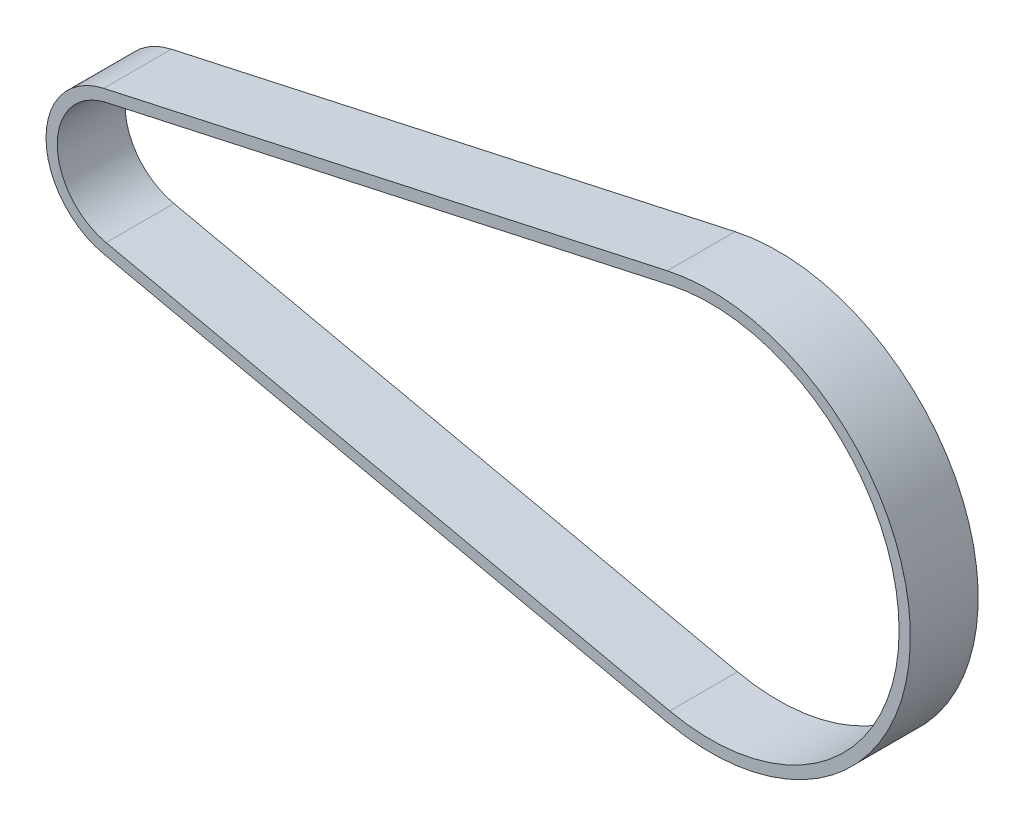
ISO-10303-21;
HEADER;
FILE_DESCRIPTION(('STEP AP214'),'2;1');
FILE_NAME('part.step','',(''),(''),'','','');
FILE_SCHEMA(('AUTOMOTIVE_DESIGN { 1 0 10303 214 1 1 1 1 }'));
ENDSEC;
DATA;
#1=APPLICATION_CONTEXT('core data for automotive mechanical design processes');
#2=APPLICATION_PROTOCOL_DEFINITION('international standard','automotive_design',2000,#1);
#3=PRODUCT_CONTEXT('',#1,'mechanical');
#4=PRODUCT('Part','Part','',(#3));
#5=PRODUCT_RELATED_PRODUCT_CATEGORY('part','',(#4));
#6=PRODUCT_DEFINITION_FORMATION('','',#4);
#7=PRODUCT_DEFINITION_CONTEXT('part definition',#1,'design');
#8=PRODUCT_DEFINITION('design','',#6,#7);
#9=PRODUCT_DEFINITION_SHAPE('','',#8);
#10=(LENGTH_UNIT() NAMED_UNIT(*) SI_UNIT(.MILLI.,.METRE.));
#11=(NAMED_UNIT(*) PLANE_ANGLE_UNIT() SI_UNIT($,.RADIAN.));
#12=(NAMED_UNIT(*) SI_UNIT($,.STERADIAN.) SOLID_ANGLE_UNIT());
#13=UNCERTAINTY_MEASURE_WITH_UNIT(LENGTH_MEASURE(1.E-05),#10,'distance_accuracy_value','');
#14=(GEOMETRIC_REPRESENTATION_CONTEXT(3) GLOBAL_UNCERTAINTY_ASSIGNED_CONTEXT((#13)) GLOBAL_UNIT_ASSIGNED_CONTEXT((#10,
#11,#12)) REPRESENTATION_CONTEXT('',''));
#15=CARTESIAN_POINT('',(0.,0.,0.));
#16=DIRECTION('',(0.,0.,1.));
#17=DIRECTION('',(1.,0.,0.));
#18=AXIS2_PLACEMENT_3D('',#15,#16,#17);
#19=CARTESIAN_POINT('',(0.,0.,6.));
#20=DIRECTION('',(0.,0.,1.));
#21=DIRECTION('',(1.,0.,0.));
#22=AXIS2_PLACEMENT_3D('',#19,#20,#21);
#23=PLANE('',#22);
#24=CARTESIAN_POINT('',(0.,0.,6.));
#25=DIRECTION('',(0.,0.,1.));
#26=DIRECTION('',(1.,0.,0.));
#27=AXIS2_PLACEMENT_3D('',#24,#25,#26);
#28=CIRCLE('',#27,6.5);
#29=CARTESIAN_POINT('',(-1.39445506692161,6.34866088764683,6.));
#30=VERTEX_POINT('',#29);
#31=CARTESIAN_POINT('',(-1.3944550669216,-6.34866088764683,6.));
#32=VERTEX_POINT('',#31);
#33=EDGE_CURVE('E153',#30,#32,#28,.T.);
#34=ORIENTED_EDGE('',*,*,#33,.T.);
#35=DIRECTION('',(0.976717059637974,-0.21453154875717,0.));
#36=VECTOR('',#35,1.);
#37=CARTESIAN_POINT('',(-1.3944550669216,-6.34866088764683,6.));
#38=LINE('',#37,#36);
#39=CARTESIAN_POINT('',(48.4985009560229,-17.3074262967849,6.));
#40=VERTEX_POINT('',#39);
#41=EDGE_CURVE('E157',#32,#40,#38,.T.);
#42=ORIENTED_EDGE('',*,*,#41,.T.);
#43=CARTESIAN_POINT('',(52.3,0.,6.));
#44=DIRECTION('',(0.,0.,1.));
#45=DIRECTION('',(1.,0.,0.));
#46=AXIS2_PLACEMENT_3D('',#43,#44,#45);
#47=CIRCLE('',#46,17.72);
#48=CARTESIAN_POINT('',(48.498500956023,17.3074262967849,6.));
#49=VERTEX_POINT('',#48);
#50=EDGE_CURVE('E161',#40,#49,#47,.T.);
#51=ORIENTED_EDGE('',*,*,#50,.T.);
#52=DIRECTION('',(-0.976717059637974,-0.21453154875717,0.));
#53=VECTOR('',#52,1.);
#54=CARTESIAN_POINT('',(-1.39445506692161,6.34866088764683,6.));
#55=LINE('',#54,#53);
#56=EDGE_CURVE('E164',#49,#30,#55,.T.);
#57=ORIENTED_EDGE('',*,*,#56,.T.);
#58=EDGE_LOOP('',(#34,#42,#51,#57));
#59=FACE_BOUND('',#58,.T.);
#60=DIRECTION('',(0.976717059637974,-0.21453154875717,0.));
#61=VECTOR('',#60,1.);
#62=CARTESIAN_POINT('',(-1.17992351816443,-5.37194382800886,6.));
#63=LINE('',#62,#61);
#64=CARTESIAN_POINT('',(-1.17992351816443,-5.37194382800886,6.));
#65=VERTEX_POINT('',#64);
#66=CARTESIAN_POINT('',(48.7130325047801,-16.3307092371469,6.));
#67=VERTEX_POINT('',#66);
#68=EDGE_CURVE('E114',#65,#67,#63,.T.);
#69=ORIENTED_EDGE('',*,*,#68,.F.);
#70=CARTESIAN_POINT('',(0.,0.,6.));
#71=DIRECTION('',(0.,0.,1.));
#72=DIRECTION('',(1.,0.,0.));
#73=AXIS2_PLACEMENT_3D('',#70,#71,#72);
#74=CIRCLE('',#73,5.5);
#75=CARTESIAN_POINT('',(-1.17992351816444,5.37194382800885,6.));
#76=VERTEX_POINT('',#75);
#77=EDGE_CURVE('E105',#76,#65,#74,.T.);
#78=ORIENTED_EDGE('',*,*,#77,.F.);
#79=DIRECTION('',(-0.976717059637974,-0.21453154875717,0.));
#80=VECTOR('',#79,1.);
#81=CARTESIAN_POINT('',(-1.17992351816444,5.37194382800885,6.));
#82=LINE('',#81,#80);
#83=CARTESIAN_POINT('',(48.7130325047801,16.3307092371469,6.));
#84=VERTEX_POINT('',#83);
#85=EDGE_CURVE('E131',#84,#76,#82,.T.);
#86=ORIENTED_EDGE('',*,*,#85,.F.);
#87=CARTESIAN_POINT('',(52.3,0.,6.));
#88=DIRECTION('',(0.,0.,1.));
#89=DIRECTION('',(1.,0.,0.));
#90=AXIS2_PLACEMENT_3D('',#87,#88,#89);
#91=CIRCLE('',#90,16.72);
#92=EDGE_CURVE('E127',#67,#84,#91,.T.);
#93=ORIENTED_EDGE('',*,*,#92,.F.);
#94=EDGE_LOOP('',(#69,#78,#86,#93));
#95=FACE_BOUND('',#94,.T.);
#96=ADVANCED_FACE('F39',(#59,#95),#23,.T.);
#97=CARTESIAN_POINT('',(0.,0.,0.));
#98=DIRECTION('',(0.,0.,1.));
#99=DIRECTION('',(1.,0.,0.));
#100=AXIS2_PLACEMENT_3D('',#97,#98,#99);
#101=PLANE('',#100);
#102=CARTESIAN_POINT('',(0.,0.,0.));
#103=DIRECTION('',(0.,0.,1.));
#104=DIRECTION('',(1.,0.,0.));
#105=AXIS2_PLACEMENT_3D('',#102,#103,#104);
#106=CIRCLE('',#105,6.5);
#107=CARTESIAN_POINT('',(-1.39445506692161,6.34866088764683,0.));
#108=VERTEX_POINT('',#107);
#109=CARTESIAN_POINT('',(-1.3944550669216,-6.34866088764683,0.));
#110=VERTEX_POINT('',#109);
#111=EDGE_CURVE('E123',#108,#110,#106,.T.);
#112=ORIENTED_EDGE('',*,*,#111,.F.);
#113=DIRECTION('',(-0.976717059637974,-0.21453154875717,0.));
#114=VECTOR('',#113,1.);
#115=CARTESIAN_POINT('',(-1.39445506692161,6.34866088764683,0.));
#116=LINE('',#115,#114);
#117=CARTESIAN_POINT('',(48.498500956023,17.3074262967849,0.));
#118=VERTEX_POINT('',#117);
#119=EDGE_CURVE('E158',#118,#108,#116,.T.);
#120=ORIENTED_EDGE('',*,*,#119,.F.);
#121=CARTESIAN_POINT('',(52.3,0.,0.));
#122=DIRECTION('',(0.,0.,1.));
#123=DIRECTION('',(1.,0.,0.));
#124=AXIS2_PLACEMENT_3D('',#121,#122,#123);
#125=CIRCLE('',#124,17.72);
#126=CARTESIAN_POINT('',(48.4985009560229,-17.3074262967849,0.));
#127=VERTEX_POINT('',#126);
#128=EDGE_CURVE('E174',#127,#118,#125,.T.);
#129=ORIENTED_EDGE('',*,*,#128,.F.);
#130=DIRECTION('',(0.976717059637974,-0.21453154875717,0.));
#131=VECTOR('',#130,1.);
#132=CARTESIAN_POINT('',(-1.3944550669216,-6.34866088764683,0.));
#133=LINE('',#132,#131);
#134=EDGE_CURVE('E171',#110,#127,#133,.T.);
#135=ORIENTED_EDGE('',*,*,#134,.F.);
#136=EDGE_LOOP('',(#112,#120,#129,#135));
#137=FACE_BOUND('',#136,.T.);
#138=CARTESIAN_POINT('',(0.,0.,0.));
#139=DIRECTION('',(0.,0.,1.));
#140=DIRECTION('',(1.,0.,0.));
#141=AXIS2_PLACEMENT_3D('',#138,#139,#140);
#142=CIRCLE('',#141,5.5);
#143=CARTESIAN_POINT('',(-1.17992351816444,5.37194382800885,0.));
#144=VERTEX_POINT('',#143);
#145=CARTESIAN_POINT('',(-1.17992351816443,-5.37194382800886,0.));
#146=VERTEX_POINT('',#145);
#147=EDGE_CURVE('E63',#144,#146,#142,.T.);
#148=ORIENTED_EDGE('',*,*,#147,.T.);
#149=DIRECTION('',(0.976717059637974,-0.21453154875717,0.));
#150=VECTOR('',#149,1.);
#151=CARTESIAN_POINT('',(-1.17992351816443,-5.37194382800886,0.));
#152=LINE('',#151,#150);
#153=CARTESIAN_POINT('',(48.7130325047801,-16.3307092371469,0.));
#154=VERTEX_POINT('',#153);
#155=EDGE_CURVE('E121',#146,#154,#152,.T.);
#156=ORIENTED_EDGE('',*,*,#155,.T.);
#157=CARTESIAN_POINT('',(52.3,0.,0.));
#158=DIRECTION('',(0.,0.,1.));
#159=DIRECTION('',(1.,0.,0.));
#160=AXIS2_PLACEMENT_3D('',#157,#158,#159);
#161=CIRCLE('',#160,16.72);
#162=CARTESIAN_POINT('',(48.7130325047801,16.3307092371469,0.));
#163=VERTEX_POINT('',#162);
#164=EDGE_CURVE('E140',#154,#163,#161,.T.);
#165=ORIENTED_EDGE('',*,*,#164,.T.);
#166=DIRECTION('',(-0.976717059637974,-0.21453154875717,0.));
#167=VECTOR('',#166,1.);
#168=CARTESIAN_POINT('',(-1.17992351816444,5.37194382800885,0.));
#169=LINE('',#168,#167);
#170=EDGE_CURVE('E115',#163,#144,#169,.T.);
#171=ORIENTED_EDGE('',*,*,#170,.T.);
#172=EDGE_LOOP('',(#148,#156,#165,#171));
#173=FACE_BOUND('',#172,.T.);
#174=ADVANCED_FACE('F197',(#137,#173),#101,.F.);
#175=CARTESIAN_POINT('',(0.,0.,6.));
#176=DIRECTION('',(0.,0.,-1.));
#177=DIRECTION('',(-1.,0.,0.));
#178=AXIS2_PLACEMENT_3D('',#175,#176,#177);
#179=CYLINDRICAL_SURFACE('',#178,6.5);
#180=ORIENTED_EDGE('',*,*,#111,.T.);
#181=DIRECTION('',(0.,0.,-1.));
#182=VECTOR('',#181,1.);
#183=CARTESIAN_POINT('',(-1.3944550669216,-6.34866088764683,6.));
#184=LINE('',#183,#182);
#185=EDGE_CURVE('E11',#32,#110,#184,.T.);
#186=ORIENTED_EDGE('',*,*,#185,.F.);
#187=ORIENTED_EDGE('',*,*,#33,.F.);
#188=DIRECTION('',(0.,0.,-1.));
#189=VECTOR('',#188,1.);
#190=CARTESIAN_POINT('',(-1.39445506692161,6.34866088764683,6.));
#191=LINE('',#190,#189);
#192=EDGE_CURVE('E167',#30,#108,#191,.T.);
#193=ORIENTED_EDGE('',*,*,#192,.T.);
#194=EDGE_LOOP('',(#180,#186,#187,#193));
#195=FACE_BOUND('',#194,.T.);
#196=ADVANCED_FACE('F41',(#195),#179,.T.);
#197=CARTESIAN_POINT('',(-1.3944550669216,-6.34866088764683,6.));
#198=DIRECTION('',(0.21453154875717,0.976717059637974,0.));
#199=DIRECTION('',(-0.976717059637974,0.21453154875717,0.));
#200=AXIS2_PLACEMENT_3D('',#197,#198,#199);
#201=PLANE('',#200);
#202=ORIENTED_EDGE('',*,*,#134,.T.);
#203=DIRECTION('',(0.,0.,-1.));
#204=VECTOR('',#203,1.);
#205=CARTESIAN_POINT('',(48.4985009560229,-17.3074262967849,6.));
#206=LINE('',#205,#204);
#207=EDGE_CURVE('E48',#40,#127,#206,.T.);
#208=ORIENTED_EDGE('',*,*,#207,.F.);
#209=ORIENTED_EDGE('',*,*,#41,.F.);
#210=ORIENTED_EDGE('',*,*,#185,.T.);
#211=EDGE_LOOP('',(#202,#208,#209,#210));
#212=FACE_BOUND('',#211,.T.);
#213=ADVANCED_FACE('F207',(#212),#201,.F.);
#214=CARTESIAN_POINT('',(52.3,0.,6.));
#215=DIRECTION('',(0.,0.,-1.));
#216=DIRECTION('',(-1.,0.,0.));
#217=AXIS2_PLACEMENT_3D('',#214,#215,#216);
#218=CYLINDRICAL_SURFACE('',#217,17.72);
#219=ORIENTED_EDGE('',*,*,#128,.T.);
#220=DIRECTION('',(0.,0.,-1.));
#221=VECTOR('',#220,1.);
#222=CARTESIAN_POINT('',(48.498500956023,17.3074262967849,6.));
#223=LINE('',#222,#221);
#224=EDGE_CURVE('E182',#49,#118,#223,.T.);
#225=ORIENTED_EDGE('',*,*,#224,.F.);
#226=ORIENTED_EDGE('',*,*,#50,.F.);
#227=ORIENTED_EDGE('',*,*,#207,.T.);
#228=EDGE_LOOP('',(#219,#225,#226,#227));
#229=FACE_BOUND('',#228,.T.);
#230=ADVANCED_FACE('F191',(#229),#218,.T.);
#231=CARTESIAN_POINT('',(-1.39445506692161,6.34866088764683,6.));
#232=DIRECTION('',(0.21453154875717,-0.976717059637974,0.));
#233=DIRECTION('',(0.976717059637974,0.21453154875717,0.));
#234=AXIS2_PLACEMENT_3D('',#231,#232,#233);
#235=PLANE('',#234);
#236=ORIENTED_EDGE('',*,*,#119,.T.);
#237=ORIENTED_EDGE('',*,*,#192,.F.);
#238=ORIENTED_EDGE('',*,*,#56,.F.);
#239=ORIENTED_EDGE('',*,*,#224,.T.);
#240=EDGE_LOOP('',(#236,#237,#238,#239));
#241=FACE_BOUND('',#240,.T.);
#242=ADVANCED_FACE('F201',(#241),#235,.F.);
#243=CARTESIAN_POINT('',(0.,0.,6.));
#244=DIRECTION('',(0.,0.,-1.));
#245=DIRECTION('',(-1.,0.,0.));
#246=AXIS2_PLACEMENT_3D('',#243,#244,#245);
#247=CYLINDRICAL_SURFACE('',#246,5.5);
#248=ORIENTED_EDGE('',*,*,#147,.F.);
#249=DIRECTION('',(0.,0.,-1.));
#250=VECTOR('',#249,1.);
#251=CARTESIAN_POINT('',(-1.17992351816444,5.37194382800885,6.));
#252=LINE('',#251,#250);
#253=EDGE_CURVE('E109',#76,#144,#252,.T.);
#254=ORIENTED_EDGE('',*,*,#253,.F.);
#255=ORIENTED_EDGE('',*,*,#77,.T.);
#256=DIRECTION('',(0.,0.,-1.));
#257=VECTOR('',#256,1.);
#258=CARTESIAN_POINT('',(-1.17992351816443,-5.37194382800886,6.));
#259=LINE('',#258,#257);
#260=EDGE_CURVE('E108',#65,#146,#259,.T.);
#261=ORIENTED_EDGE('',*,*,#260,.T.);
#262=EDGE_LOOP('',(#248,#254,#255,#261));
#263=FACE_BOUND('',#262,.T.);
#264=ADVANCED_FACE('F107',(#263),#247,.F.);
#265=CARTESIAN_POINT('',(-1.17992351816443,-5.37194382800886,6.));
#266=DIRECTION('',(0.21453154875717,0.976717059637974,0.));
#267=DIRECTION('',(-0.976717059637974,0.21453154875717,0.));
#268=AXIS2_PLACEMENT_3D('',#265,#266,#267);
#269=PLANE('',#268);
#270=ORIENTED_EDGE('',*,*,#155,.F.);
#271=ORIENTED_EDGE('',*,*,#260,.F.);
#272=ORIENTED_EDGE('',*,*,#68,.T.);
#273=DIRECTION('',(0.,0.,-1.));
#274=VECTOR('',#273,1.);
#275=CARTESIAN_POINT('',(48.7130325047801,-16.3307092371469,6.));
#276=LINE('',#275,#274);
#277=EDGE_CURVE('E124',#67,#154,#276,.T.);
#278=ORIENTED_EDGE('',*,*,#277,.T.);
#279=EDGE_LOOP('',(#270,#271,#272,#278));
#280=FACE_BOUND('',#279,.T.);
#281=ADVANCED_FACE('F118',(#280),#269,.T.);
#282=CARTESIAN_POINT('',(52.3,0.,6.));
#283=DIRECTION('',(0.,0.,-1.));
#284=DIRECTION('',(-1.,0.,0.));
#285=AXIS2_PLACEMENT_3D('',#282,#283,#284);
#286=CYLINDRICAL_SURFACE('',#285,16.72);
#287=ORIENTED_EDGE('',*,*,#164,.F.);
#288=ORIENTED_EDGE('',*,*,#277,.F.);
#289=ORIENTED_EDGE('',*,*,#92,.T.);
#290=DIRECTION('',(0.,0.,-1.));
#291=VECTOR('',#290,1.);
#292=CARTESIAN_POINT('',(48.7130325047801,16.3307092371469,6.));
#293=LINE('',#292,#291);
#294=EDGE_CURVE('E55',#84,#163,#293,.T.);
#295=ORIENTED_EDGE('',*,*,#294,.T.);
#296=EDGE_LOOP('',(#287,#288,#289,#295));
#297=FACE_BOUND('',#296,.T.);
#298=ADVANCED_FACE('F230',(#297),#286,.F.);
#299=CARTESIAN_POINT('',(-1.17992351816444,5.37194382800885,6.));
#300=DIRECTION('',(0.21453154875717,-0.976717059637974,0.));
#301=DIRECTION('',(0.976717059637974,0.21453154875717,0.));
#302=AXIS2_PLACEMENT_3D('',#299,#300,#301);
#303=PLANE('',#302);
#304=ORIENTED_EDGE('',*,*,#170,.F.);
#305=ORIENTED_EDGE('',*,*,#294,.F.);
#306=ORIENTED_EDGE('',*,*,#85,.T.);
#307=ORIENTED_EDGE('',*,*,#253,.T.);
#308=EDGE_LOOP('',(#304,#305,#306,#307));
#309=FACE_BOUND('',#308,.T.);
#310=ADVANCED_FACE('F234',(#309),#303,.T.);
#311=CLOSED_SHELL('',(#96,#174,#196,#213,#230,#242,#264,#281,#298,#310));
#312=MANIFOLD_SOLID_BREP('B2',#311);
#313=ADVANCED_BREP_SHAPE_REPRESENTATION('',(#18,#312),#14);
#314=SHAPE_DEFINITION_REPRESENTATION(#9,#313);
ENDSEC;
END-ISO-10303-21;
